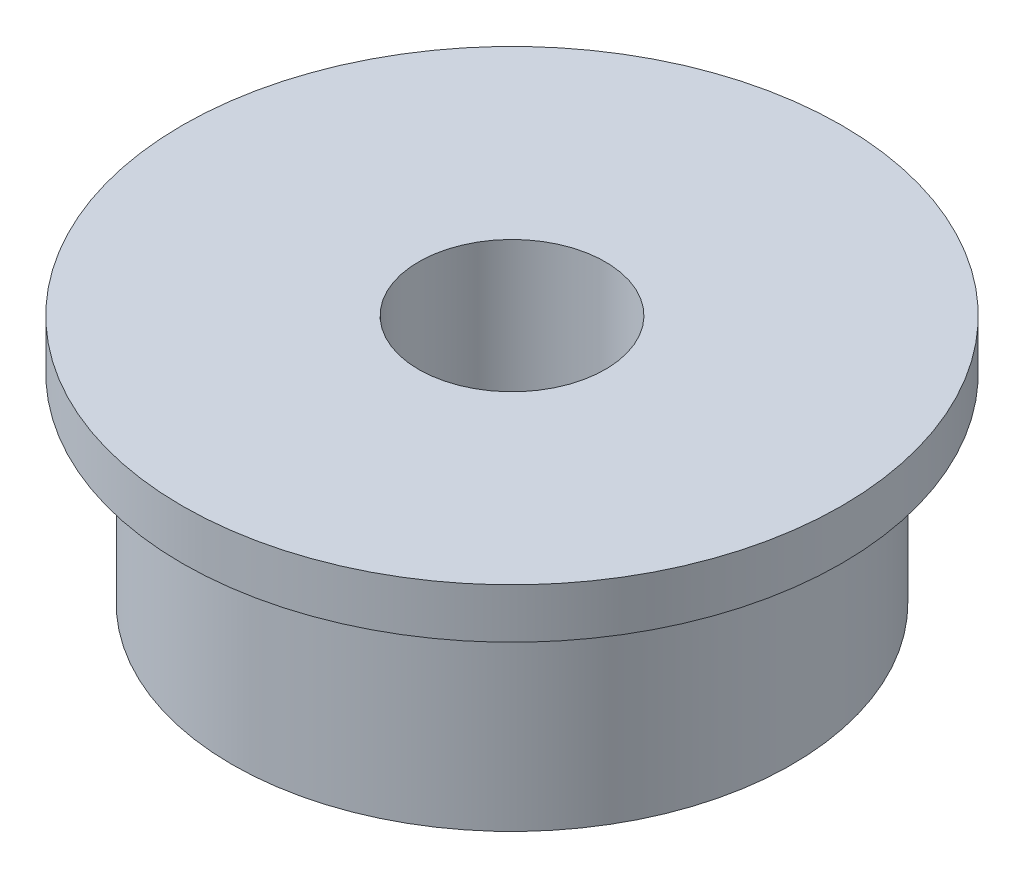
ISO-10303-21;
HEADER;
FILE_DESCRIPTION(('STEP AP214'),'2;1');
FILE_NAME('part.step','',(''),(''),'','','');
FILE_SCHEMA(('AUTOMOTIVE_DESIGN { 1 0 10303 214 1 1 1 1 }'));
ENDSEC;
DATA;
#1=APPLICATION_CONTEXT('core data for automotive mechanical design processes');
#2=APPLICATION_PROTOCOL_DEFINITION('international standard','automotive_design',2000,#1);
#3=PRODUCT_CONTEXT('',#1,'mechanical');
#4=PRODUCT('Part','Part','',(#3));
#5=PRODUCT_RELATED_PRODUCT_CATEGORY('part','',(#4));
#6=PRODUCT_DEFINITION_FORMATION('','',#4);
#7=PRODUCT_DEFINITION_CONTEXT('part definition',#1,'design');
#8=PRODUCT_DEFINITION('design','',#6,#7);
#9=PRODUCT_DEFINITION_SHAPE('','',#8);
#10=(LENGTH_UNIT() NAMED_UNIT(*) SI_UNIT(.MILLI.,.METRE.));
#11=(NAMED_UNIT(*) PLANE_ANGLE_UNIT() SI_UNIT($,.RADIAN.));
#12=(NAMED_UNIT(*) SI_UNIT($,.STERADIAN.) SOLID_ANGLE_UNIT());
#13=UNCERTAINTY_MEASURE_WITH_UNIT(LENGTH_MEASURE(1.E-05),#10,'distance_accuracy_value','');
#14=(GEOMETRIC_REPRESENTATION_CONTEXT(3) GLOBAL_UNCERTAINTY_ASSIGNED_CONTEXT((#13)) GLOBAL_UNIT_ASSIGNED_CONTEXT((#10,
#11,#12)) REPRESENTATION_CONTEXT('',''));
#15=CARTESIAN_POINT('',(0.,0.,0.));
#16=DIRECTION('',(0.,0.,1.));
#17=DIRECTION('',(1.,0.,0.));
#18=AXIS2_PLACEMENT_3D('',#15,#16,#17);
#19=CARTESIAN_POINT('',(0.,4.,0.));
#20=DIRECTION('',(0.,-1.,0.));
#21=DIRECTION('',(0.,0.,-1.));
#22=AXIS2_PLACEMENT_3D('',#19,#20,#21);
#23=CYLINDRICAL_SURFACE('',#22,4.5);
#24=CARTESIAN_POINT('',(0.,0.,0.));
#25=DIRECTION('',(0.,1.,0.));
#26=DIRECTION('',(0.,0.,1.));
#27=AXIS2_PLACEMENT_3D('',#24,#25,#26);
#28=CIRCLE('',#27,4.5);
#29=CARTESIAN_POINT('',(0.,0.,4.5));
#30=VERTEX_POINT('',#29);
#31=EDGE_CURVE('E43',#30,#30,#28,.T.);
#32=ORIENTED_EDGE('',*,*,#31,.T.);
#33=EDGE_LOOP('',(#32));
#34=FACE_BOUND('',#33,.T.);
#35=CARTESIAN_POINT('',(0.,3.2,0.));
#36=DIRECTION('',(0.,1.,0.));
#37=DIRECTION('',(0.,0.,1.));
#38=AXIS2_PLACEMENT_3D('',#35,#36,#37);
#39=CIRCLE('',#38,4.5);
#40=CARTESIAN_POINT('',(0.,3.2,4.5));
#41=VERTEX_POINT('',#40);
#42=EDGE_CURVE('E10',#41,#41,#39,.T.);
#43=ORIENTED_EDGE('',*,*,#42,.F.);
#44=EDGE_LOOP('',(#43));
#45=FACE_BOUND('',#44,.T.);
#46=ADVANCED_FACE('F37',(#34,#45),#23,.T.);
#47=CARTESIAN_POINT('',(0.,4.,0.));
#48=DIRECTION('',(0.,1.,0.));
#49=DIRECTION('',(0.,0.,1.));
#50=AXIS2_PLACEMENT_3D('',#47,#48,#49);
#51=PLANE('',#50);
#52=CARTESIAN_POINT('',(0.,4.,0.));
#53=DIRECTION('',(0.,1.,0.));
#54=DIRECTION('',(0.,0.,1.));
#55=AXIS2_PLACEMENT_3D('',#52,#53,#54);
#56=CIRCLE('',#55,1.5);
#57=CARTESIAN_POINT('',(0.,4.,1.5));
#58=VERTEX_POINT('',#57);
#59=EDGE_CURVE('E47',#58,#58,#56,.T.);
#60=ORIENTED_EDGE('',*,*,#59,.F.);
#61=EDGE_LOOP('',(#60));
#62=FACE_BOUND('',#61,.T.);
#63=CARTESIAN_POINT('',(0.,4.,0.));
#64=DIRECTION('',(0.,1.,0.));
#65=DIRECTION('',(0.,0.,1.));
#66=AXIS2_PLACEMENT_3D('',#63,#64,#65);
#67=CIRCLE('',#66,5.3);
#68=CARTESIAN_POINT('',(0.,4.,5.3));
#69=VERTEX_POINT('',#68);
#70=EDGE_CURVE('E57',#69,#69,#67,.T.);
#71=ORIENTED_EDGE('',*,*,#70,.T.);
#72=EDGE_LOOP('',(#71));
#73=FACE_BOUND('',#72,.T.);
#74=ADVANCED_FACE('F75',(#62,#73),#51,.T.);
#75=CARTESIAN_POINT('',(0.,0.,0.));
#76=DIRECTION('',(0.,1.,0.));
#77=DIRECTION('',(0.,0.,1.));
#78=AXIS2_PLACEMENT_3D('',#75,#76,#77);
#79=PLANE('',#78);
#80=ORIENTED_EDGE('',*,*,#31,.F.);
#81=EDGE_LOOP('',(#80));
#82=FACE_BOUND('',#81,.T.);
#83=CARTESIAN_POINT('',(0.,0.,0.));
#84=DIRECTION('',(0.,1.,0.));
#85=DIRECTION('',(0.,0.,1.));
#86=AXIS2_PLACEMENT_3D('',#83,#84,#85);
#87=CIRCLE('',#86,1.5);
#88=CARTESIAN_POINT('',(0.,0.,1.5));
#89=VERTEX_POINT('',#88);
#90=EDGE_CURVE('E51',#89,#89,#87,.T.);
#91=ORIENTED_EDGE('',*,*,#90,.T.);
#92=EDGE_LOOP('',(#91));
#93=FACE_BOUND('',#92,.T.);
#94=ADVANCED_FACE('F79',(#82,#93),#79,.F.);
#95=CARTESIAN_POINT('',(0.,4.,0.));
#96=DIRECTION('',(0.,-1.,0.));
#97=DIRECTION('',(0.,0.,-1.));
#98=AXIS2_PLACEMENT_3D('',#95,#96,#97);
#99=CYLINDRICAL_SURFACE('',#98,1.5);
#100=ORIENTED_EDGE('',*,*,#59,.T.);
#101=EDGE_LOOP('',(#100));
#102=FACE_BOUND('',#101,.T.);
#103=ORIENTED_EDGE('',*,*,#90,.F.);
#104=EDGE_LOOP('',(#103));
#105=FACE_BOUND('',#104,.T.);
#106=ADVANCED_FACE('F72',(#102,#105),#99,.F.);
#107=CARTESIAN_POINT('',(0.,3.2,0.));
#108=DIRECTION('',(0.,1.,0.));
#109=DIRECTION('',(0.,0.,1.));
#110=AXIS2_PLACEMENT_3D('',#107,#108,#109);
#111=CYLINDRICAL_SURFACE('',#110,5.3);
#112=CARTESIAN_POINT('',(0.,3.2,0.));
#113=DIRECTION('',(0.,1.,0.));
#114=DIRECTION('',(0.,0.,1.));
#115=AXIS2_PLACEMENT_3D('',#112,#113,#114);
#116=CIRCLE('',#115,5.3);
#117=CARTESIAN_POINT('',(0.,3.2,5.3));
#118=VERTEX_POINT('',#117);
#119=EDGE_CURVE('E55',#118,#118,#116,.T.);
#120=ORIENTED_EDGE('',*,*,#119,.T.);
#121=EDGE_LOOP('',(#120));
#122=FACE_BOUND('',#121,.T.);
#123=ORIENTED_EDGE('',*,*,#70,.F.);
#124=EDGE_LOOP('',(#123));
#125=FACE_BOUND('',#124,.T.);
#126=ADVANCED_FACE('F63',(#122,#125),#111,.T.);
#127=CARTESIAN_POINT('',(0.,3.2,0.));
#128=DIRECTION('',(0.,1.,0.));
#129=DIRECTION('',(0.,0.,1.));
#130=AXIS2_PLACEMENT_3D('',#127,#128,#129);
#131=PLANE('',#130);
#132=ORIENTED_EDGE('',*,*,#42,.T.);
#133=EDGE_LOOP('',(#132));
#134=FACE_BOUND('',#133,.T.);
#135=ORIENTED_EDGE('',*,*,#119,.F.);
#136=EDGE_LOOP('',(#135));
#137=FACE_BOUND('',#136,.T.);
#138=ADVANCED_FACE('F66',(#134,#137),#131,.F.);
#139=CLOSED_SHELL('',(#46,#74,#94,#106,#126,#138));
#140=MANIFOLD_SOLID_BREP('B2',#139);
#141=ADVANCED_BREP_SHAPE_REPRESENTATION('',(#18,#140),#14);
#142=SHAPE_DEFINITION_REPRESENTATION(#9,#141);
ENDSEC;
END-ISO-10303-21;
